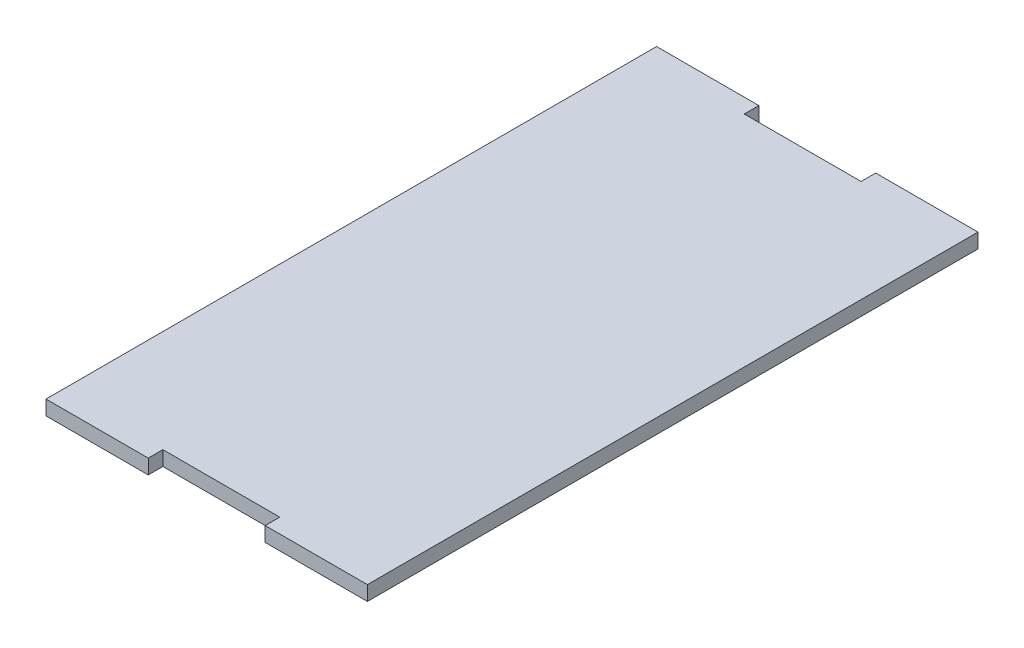
ISO-10303-21;
HEADER;
FILE_DESCRIPTION(('STEP AP214'),'2;1');
FILE_NAME('part.step','',(''),(''),'','','');
FILE_SCHEMA(('AUTOMOTIVE_DESIGN { 1 0 10303 214 1 1 1 1 }'));
ENDSEC;
DATA;
#1=APPLICATION_CONTEXT('core data for automotive mechanical design processes');
#2=APPLICATION_PROTOCOL_DEFINITION('international standard','automotive_design',2000,#1);
#3=PRODUCT_CONTEXT('',#1,'mechanical');
#4=PRODUCT('Part','Part','',(#3));
#5=PRODUCT_RELATED_PRODUCT_CATEGORY('part','',(#4));
#6=PRODUCT_DEFINITION_FORMATION('','',#4);
#7=PRODUCT_DEFINITION_CONTEXT('part definition',#1,'design');
#8=PRODUCT_DEFINITION('design','',#6,#7);
#9=PRODUCT_DEFINITION_SHAPE('','',#8);
#10=(LENGTH_UNIT() NAMED_UNIT(*) SI_UNIT(.MILLI.,.METRE.));
#11=(NAMED_UNIT(*) PLANE_ANGLE_UNIT() SI_UNIT($,.RADIAN.));
#12=(NAMED_UNIT(*) SI_UNIT($,.STERADIAN.) SOLID_ANGLE_UNIT());
#13=UNCERTAINTY_MEASURE_WITH_UNIT(LENGTH_MEASURE(1.E-05),#10,'distance_accuracy_value','');
#14=(GEOMETRIC_REPRESENTATION_CONTEXT(3) GLOBAL_UNCERTAINTY_ASSIGNED_CONTEXT((#13)) GLOBAL_UNIT_ASSIGNED_CONTEXT((#10,
#11,#12)) REPRESENTATION_CONTEXT('',''));
#15=CARTESIAN_POINT('',(0.,0.,0.));
#16=DIRECTION('',(0.,0.,1.));
#17=DIRECTION('',(1.,0.,0.));
#18=AXIS2_PLACEMENT_3D('',#15,#16,#17);
#19=CARTESIAN_POINT('',(0.,6.35,0.));
#20=DIRECTION('',(0.,1.,0.));
#21=DIRECTION('',(0.,0.,1.));
#22=AXIS2_PLACEMENT_3D('',#19,#20,#21);
#23=PLANE('',#22);
#24=DIRECTION('',(1.,0.,0.));
#25=VECTOR('',#24,1.);
#26=CARTESIAN_POINT('',(197.7,6.35,132.7));
#27=LINE('',#26,#25);
#28=CARTESIAN_POINT('',(25.4,6.35,132.7));
#29=VERTEX_POINT('',#28);
#30=CARTESIAN_POINT('',(69.85,6.35,132.7));
#31=VERTEX_POINT('',#30);
#32=EDGE_CURVE('E51',#29,#31,#27,.T.);
#33=ORIENTED_EDGE('',*,*,#32,.T.);
#34=DIRECTION('',(0.,0.,1.));
#35=VECTOR('',#34,1.);
#36=CARTESIAN_POINT('',(69.85,6.35,0.));
#37=LINE('',#36,#35);
#38=CARTESIAN_POINT('',(69.85,6.35,-132.7));
#39=VERTEX_POINT('',#38);
#40=EDGE_CURVE('E59',#39,#31,#37,.T.);
#41=ORIENTED_EDGE('',*,*,#40,.F.);
#42=DIRECTION('',(-1.,0.,0.));
#43=VECTOR('',#42,1.);
#44=CARTESIAN_POINT('',(197.7,6.35,-132.7));
#45=LINE('',#44,#43);
#46=CARTESIAN_POINT('',(25.4,6.35,-132.7));
#47=VERTEX_POINT('',#46);
#48=EDGE_CURVE('E144',#39,#47,#45,.T.);
#49=ORIENTED_EDGE('',*,*,#48,.T.);
#50=DIRECTION('',(0.,0.,-1.));
#51=VECTOR('',#50,1.);
#52=CARTESIAN_POINT('',(25.4000000000001,6.35,0.));
#53=LINE('',#52,#51);
#54=CARTESIAN_POINT('',(25.4,6.35,-126.35));
#55=VERTEX_POINT('',#54);
#56=EDGE_CURVE('E198',#55,#47,#53,.T.);
#57=ORIENTED_EDGE('',*,*,#56,.F.);
#58=DIRECTION('',(1.,0.,0.));
#59=VECTOR('',#58,1.);
#60=CARTESIAN_POINT('',(0.,6.35,-126.35));
#61=LINE('',#60,#59);
#62=CARTESIAN_POINT('',(-25.4,6.35,-126.35));
#63=VERTEX_POINT('',#62);
#64=EDGE_CURVE('E201',#63,#55,#61,.T.);
#65=ORIENTED_EDGE('',*,*,#64,.F.);
#66=DIRECTION('',(0.,0.,-1.));
#67=VECTOR('',#66,1.);
#68=CARTESIAN_POINT('',(-25.3999999999999,6.35,0.));
#69=LINE('',#68,#67);
#70=CARTESIAN_POINT('',(-25.4,6.35,-132.7));
#71=VERTEX_POINT('',#70);
#72=EDGE_CURVE('E205',#63,#71,#69,.T.);
#73=ORIENTED_EDGE('',*,*,#72,.T.);
#74=CARTESIAN_POINT('',(-69.8499999999999,6.35,-132.7));
#75=VERTEX_POINT('',#74);
#76=EDGE_CURVE('E154',#71,#75,#45,.T.);
#77=ORIENTED_EDGE('',*,*,#76,.T.);
#78=DIRECTION('',(0.,0.,1.));
#79=VECTOR('',#78,1.);
#80=CARTESIAN_POINT('',(-69.8499999999999,6.35,0.));
#81=LINE('',#80,#79);
#82=CARTESIAN_POINT('',(-69.8499999999999,6.35,132.7));
#83=VERTEX_POINT('',#82);
#84=EDGE_CURVE('E244',#75,#83,#81,.T.);
#85=ORIENTED_EDGE('',*,*,#84,.T.);
#86=CARTESIAN_POINT('',(-25.4,6.35,132.7));
#87=VERTEX_POINT('',#86);
#88=EDGE_CURVE('E11',#83,#87,#27,.T.);
#89=ORIENTED_EDGE('',*,*,#88,.T.);
#90=DIRECTION('',(0.,0.,1.));
#91=VECTOR('',#90,1.);
#92=CARTESIAN_POINT('',(-25.3999999999999,6.35,0.));
#93=LINE('',#92,#91);
#94=CARTESIAN_POINT('',(-25.4,6.35,126.35));
#95=VERTEX_POINT('',#94);
#96=EDGE_CURVE('E268',#95,#87,#93,.T.);
#97=ORIENTED_EDGE('',*,*,#96,.F.);
#98=DIRECTION('',(-1.,0.,0.));
#99=VECTOR('',#98,1.);
#100=CARTESIAN_POINT('',(0.,6.35,126.35));
#101=LINE('',#100,#99);
#102=CARTESIAN_POINT('',(25.4,6.35,126.35));
#103=VERTEX_POINT('',#102);
#104=EDGE_CURVE('E265',#103,#95,#101,.T.);
#105=ORIENTED_EDGE('',*,*,#104,.F.);
#106=DIRECTION('',(0.,0.,1.));
#107=VECTOR('',#106,1.);
#108=CARTESIAN_POINT('',(25.4000000000001,6.35,0.));
#109=LINE('',#108,#107);
#110=EDGE_CURVE('E197',#103,#29,#109,.T.);
#111=ORIENTED_EDGE('',*,*,#110,.T.);
#112=EDGE_LOOP('',(#33,#41,#49,#57,#65,#73,#77,#85,#89,#97,#105,#111));
#113=FACE_BOUND('',#112,.T.);
#114=ADVANCED_FACE('F41',(#113),#23,.T.);
#115=CARTESIAN_POINT('',(0.,0.,0.));
#116=DIRECTION('',(0.,1.,0.));
#117=DIRECTION('',(0.,0.,1.));
#118=AXIS2_PLACEMENT_3D('',#115,#116,#117);
#119=PLANE('',#118);
#120=DIRECTION('',(0.,0.,1.));
#121=VECTOR('',#120,1.);
#122=CARTESIAN_POINT('',(69.85,0.,0.));
#123=LINE('',#122,#121);
#124=CARTESIAN_POINT('',(69.85,0.,-132.7));
#125=VERTEX_POINT('',#124);
#126=CARTESIAN_POINT('',(69.85,0.,132.7));
#127=VERTEX_POINT('',#126);
#128=EDGE_CURVE('E133',#125,#127,#123,.T.);
#129=ORIENTED_EDGE('',*,*,#128,.T.);
#130=DIRECTION('',(1.,0.,0.));
#131=VECTOR('',#130,1.);
#132=CARTESIAN_POINT('',(197.7,0.,132.7));
#133=LINE('',#132,#131);
#134=CARTESIAN_POINT('',(25.4,0.,132.7));
#135=VERTEX_POINT('',#134);
#136=EDGE_CURVE('E164',#135,#127,#133,.T.);
#137=ORIENTED_EDGE('',*,*,#136,.F.);
#138=DIRECTION('',(0.,0.,1.));
#139=VECTOR('',#138,1.);
#140=CARTESIAN_POINT('',(25.4000000000001,0.,0.));
#141=LINE('',#140,#139);
#142=CARTESIAN_POINT('',(25.4,0.,126.35));
#143=VERTEX_POINT('',#142);
#144=EDGE_CURVE('E189',#143,#135,#141,.T.);
#145=ORIENTED_EDGE('',*,*,#144,.F.);
#146=DIRECTION('',(-1.,0.,0.));
#147=VECTOR('',#146,1.);
#148=CARTESIAN_POINT('',(0.,0.,126.35));
#149=LINE('',#148,#147);
#150=CARTESIAN_POINT('',(-25.4,0.,126.35));
#151=VERTEX_POINT('',#150);
#152=EDGE_CURVE('E257',#143,#151,#149,.T.);
#153=ORIENTED_EDGE('',*,*,#152,.T.);
#154=DIRECTION('',(0.,0.,1.));
#155=VECTOR('',#154,1.);
#156=CARTESIAN_POINT('',(-25.3999999999999,0.,0.));
#157=LINE('',#156,#155);
#158=CARTESIAN_POINT('',(-25.4,0.,132.7));
#159=VERTEX_POINT('',#158);
#160=EDGE_CURVE('E220',#151,#159,#157,.T.);
#161=ORIENTED_EDGE('',*,*,#160,.T.);
#162=CARTESIAN_POINT('',(-69.8499999999999,0.,132.7));
#163=VERTEX_POINT('',#162);
#164=EDGE_CURVE('E45',#163,#159,#133,.T.);
#165=ORIENTED_EDGE('',*,*,#164,.F.);
#166=DIRECTION('',(0.,0.,1.));
#167=VECTOR('',#166,1.);
#168=CARTESIAN_POINT('',(-69.8499999999999,0.,0.));
#169=LINE('',#168,#167);
#170=CARTESIAN_POINT('',(-69.8499999999999,0.,-132.7));
#171=VERTEX_POINT('',#170);
#172=EDGE_CURVE('E67',#171,#163,#169,.T.);
#173=ORIENTED_EDGE('',*,*,#172,.F.);
#174=DIRECTION('',(-1.,0.,0.));
#175=VECTOR('',#174,1.);
#176=CARTESIAN_POINT('',(197.7,0.,-132.7));
#177=LINE('',#176,#175);
#178=CARTESIAN_POINT('',(-25.4,0.,-132.7));
#179=VERTEX_POINT('',#178);
#180=EDGE_CURVE('E165',#179,#171,#177,.T.);
#181=ORIENTED_EDGE('',*,*,#180,.F.);
#182=DIRECTION('',(0.,0.,-1.));
#183=VECTOR('',#182,1.);
#184=CARTESIAN_POINT('',(-25.3999999999999,0.,0.));
#185=LINE('',#184,#183);
#186=CARTESIAN_POINT('',(-25.4,0.,-126.35));
#187=VERTEX_POINT('',#186);
#188=EDGE_CURVE('E202',#187,#179,#185,.T.);
#189=ORIENTED_EDGE('',*,*,#188,.F.);
#190=DIRECTION('',(1.,0.,0.));
#191=VECTOR('',#190,1.);
#192=CARTESIAN_POINT('',(0.,0.,-126.35));
#193=LINE('',#192,#191);
#194=CARTESIAN_POINT('',(25.4,0.,-126.35));
#195=VERTEX_POINT('',#194);
#196=EDGE_CURVE('E212',#187,#195,#193,.T.);
#197=ORIENTED_EDGE('',*,*,#196,.T.);
#198=DIRECTION('',(0.,0.,-1.));
#199=VECTOR('',#198,1.);
#200=CARTESIAN_POINT('',(25.4000000000001,0.,0.));
#201=LINE('',#200,#199);
#202=CARTESIAN_POINT('',(25.4,0.,-132.7));
#203=VERTEX_POINT('',#202);
#204=EDGE_CURVE('E138',#195,#203,#201,.T.);
#205=ORIENTED_EDGE('',*,*,#204,.T.);
#206=EDGE_CURVE('E162',#125,#203,#177,.T.);
#207=ORIENTED_EDGE('',*,*,#206,.F.);
#208=EDGE_LOOP('',(#129,#137,#145,#153,#161,#165,#173,#181,#189,#197,#205,#207));
#209=FACE_BOUND('',#208,.T.);
#210=ADVANCED_FACE('F238',(#209),#119,.F.);
#211=CARTESIAN_POINT('',(197.7,6.35,-132.7));
#212=DIRECTION('',(0.,0.,1.));
#213=DIRECTION('',(1.,0.,0.));
#214=AXIS2_PLACEMENT_3D('',#211,#212,#213);
#215=PLANE('',#214);
#216=DIRECTION('',(0.,-1.,0.));
#217=VECTOR('',#216,1.);
#218=CARTESIAN_POINT('',(69.85,6.35,-132.7));
#219=LINE('',#218,#217);
#220=EDGE_CURVE('E130',#39,#125,#219,.T.);
#221=ORIENTED_EDGE('',*,*,#220,.T.);
#222=ORIENTED_EDGE('',*,*,#206,.T.);
#223=DIRECTION('',(0.,-1.,0.));
#224=VECTOR('',#223,1.);
#225=CARTESIAN_POINT('',(25.4,6.35,-132.7));
#226=LINE('',#225,#224);
#227=EDGE_CURVE('E152',#47,#203,#226,.T.);
#228=ORIENTED_EDGE('',*,*,#227,.F.);
#229=ORIENTED_EDGE('',*,*,#48,.F.);
#230=EDGE_LOOP('',(#221,#222,#228,#229));
#231=FACE_BOUND('',#230,.T.);
#232=ADVANCED_FACE('F43',(#231),#215,.F.);
#233=CARTESIAN_POINT('',(197.7,6.35,132.7));
#234=DIRECTION('',(0.,0.,-1.));
#235=DIRECTION('',(-1.,0.,0.));
#236=AXIS2_PLACEMENT_3D('',#233,#234,#235);
#237=PLANE('',#236);
#238=DIRECTION('',(0.,-1.,0.));
#239=VECTOR('',#238,1.);
#240=CARTESIAN_POINT('',(69.85,6.35,132.7));
#241=LINE('',#240,#239);
#242=EDGE_CURVE('E139',#31,#127,#241,.T.);
#243=ORIENTED_EDGE('',*,*,#242,.F.);
#244=ORIENTED_EDGE('',*,*,#32,.F.);
#245=DIRECTION('',(0.,-1.,0.));
#246=VECTOR('',#245,1.);
#247=CARTESIAN_POINT('',(25.4,6.35,132.7));
#248=LINE('',#247,#246);
#249=EDGE_CURVE('E177',#29,#135,#248,.T.);
#250=ORIENTED_EDGE('',*,*,#249,.T.);
#251=ORIENTED_EDGE('',*,*,#136,.T.);
#252=EDGE_LOOP('',(#243,#244,#250,#251));
#253=FACE_BOUND('',#252,.T.);
#254=ADVANCED_FACE('F282',(#253),#237,.F.);
#255=ORIENTED_EDGE('',*,*,#180,.T.);
#256=DIRECTION('',(0.,-1.,0.));
#257=VECTOR('',#256,1.);
#258=CARTESIAN_POINT('',(-69.8499999999999,6.35,-132.7));
#259=LINE('',#258,#257);
#260=EDGE_CURVE('E242',#75,#171,#259,.T.);
#261=ORIENTED_EDGE('',*,*,#260,.F.);
#262=ORIENTED_EDGE('',*,*,#76,.F.);
#263=DIRECTION('',(0.,-1.,0.));
#264=VECTOR('',#263,1.);
#265=CARTESIAN_POINT('',(-25.4,6.35,-132.7));
#266=LINE('',#265,#264);
#267=EDGE_CURVE('E221',#71,#179,#266,.T.);
#268=ORIENTED_EDGE('',*,*,#267,.T.);
#269=EDGE_LOOP('',(#255,#261,#262,#268));
#270=FACE_BOUND('',#269,.T.);
#271=ADVANCED_FACE('F241',(#270),#215,.F.);
#272=ORIENTED_EDGE('',*,*,#88,.F.);
#273=DIRECTION('',(0.,-1.,0.));
#274=VECTOR('',#273,1.);
#275=CARTESIAN_POINT('',(-69.8499999999999,6.35,132.7));
#276=LINE('',#275,#274);
#277=EDGE_CURVE('E251',#83,#163,#276,.T.);
#278=ORIENTED_EDGE('',*,*,#277,.T.);
#279=ORIENTED_EDGE('',*,*,#164,.T.);
#280=DIRECTION('',(0.,-1.,0.));
#281=VECTOR('',#280,1.);
#282=CARTESIAN_POINT('',(-25.4,6.35,132.7));
#283=LINE('',#282,#281);
#284=EDGE_CURVE('E170',#87,#159,#283,.T.);
#285=ORIENTED_EDGE('',*,*,#284,.F.);
#286=EDGE_LOOP('',(#272,#278,#279,#285));
#287=FACE_BOUND('',#286,.T.);
#288=ADVANCED_FACE('F250',(#287),#237,.F.);
#289=CARTESIAN_POINT('',(-25.3999999999999,6.35,0.));
#290=DIRECTION('',(1.,0.,0.));
#291=DIRECTION('',(0.,0.,-1.));
#292=AXIS2_PLACEMENT_3D('',#289,#290,#291);
#293=PLANE('',#292);
#294=ORIENTED_EDGE('',*,*,#160,.F.);
#295=DIRECTION('',(0.,-1.,0.));
#296=VECTOR('',#295,1.);
#297=CARTESIAN_POINT('',(-25.4,6.35,126.35));
#298=LINE('',#297,#296);
#299=EDGE_CURVE('E194',#95,#151,#298,.T.);
#300=ORIENTED_EDGE('',*,*,#299,.F.);
#301=ORIENTED_EDGE('',*,*,#96,.T.);
#302=ORIENTED_EDGE('',*,*,#284,.T.);
#303=EDGE_LOOP('',(#294,#300,#301,#302));
#304=FACE_BOUND('',#303,.T.);
#305=ADVANCED_FACE('F289',(#304),#293,.T.);
#306=CARTESIAN_POINT('',(25.4000000000001,6.35,0.));
#307=DIRECTION('',(1.,0.,0.));
#308=DIRECTION('',(0.,0.,-1.));
#309=AXIS2_PLACEMENT_3D('',#306,#307,#308);
#310=PLANE('',#309);
#311=ORIENTED_EDGE('',*,*,#144,.T.);
#312=ORIENTED_EDGE('',*,*,#249,.F.);
#313=ORIENTED_EDGE('',*,*,#110,.F.);
#314=DIRECTION('',(0.,-1.,0.));
#315=VECTOR('',#314,1.);
#316=CARTESIAN_POINT('',(25.4,6.35,126.35));
#317=LINE('',#316,#315);
#318=EDGE_CURVE('E186',#103,#143,#317,.T.);
#319=ORIENTED_EDGE('',*,*,#318,.T.);
#320=EDGE_LOOP('',(#311,#312,#313,#319));
#321=FACE_BOUND('',#320,.T.);
#322=ADVANCED_FACE('F285',(#321),#310,.F.);
#323=CARTESIAN_POINT('',(0.,6.35,126.35));
#324=DIRECTION('',(0.,0.,1.));
#325=DIRECTION('',(1.,0.,0.));
#326=AXIS2_PLACEMENT_3D('',#323,#324,#325);
#327=PLANE('',#326);
#328=ORIENTED_EDGE('',*,*,#152,.F.);
#329=ORIENTED_EDGE('',*,*,#318,.F.);
#330=ORIENTED_EDGE('',*,*,#104,.T.);
#331=ORIENTED_EDGE('',*,*,#299,.T.);
#332=EDGE_LOOP('',(#328,#329,#330,#331));
#333=FACE_BOUND('',#332,.T.);
#334=ADVANCED_FACE('F288',(#333),#327,.T.);
#335=CARTESIAN_POINT('',(25.4000000000001,6.35,0.));
#336=DIRECTION('',(-1.,0.,0.));
#337=DIRECTION('',(0.,0.,1.));
#338=AXIS2_PLACEMENT_3D('',#335,#336,#337);
#339=PLANE('',#338);
#340=ORIENTED_EDGE('',*,*,#204,.F.);
#341=DIRECTION('',(0.,-1.,0.));
#342=VECTOR('',#341,1.);
#343=CARTESIAN_POINT('',(25.4,6.35,-126.35));
#344=LINE('',#343,#342);
#345=EDGE_CURVE('E160',#55,#195,#344,.T.);
#346=ORIENTED_EDGE('',*,*,#345,.F.);
#347=ORIENTED_EDGE('',*,*,#56,.T.);
#348=ORIENTED_EDGE('',*,*,#227,.T.);
#349=EDGE_LOOP('',(#340,#346,#347,#348));
#350=FACE_BOUND('',#349,.T.);
#351=ADVANCED_FACE('F236',(#350),#339,.T.);
#352=CARTESIAN_POINT('',(-25.3999999999999,6.35,0.));
#353=DIRECTION('',(-1.,0.,0.));
#354=DIRECTION('',(0.,0.,1.));
#355=AXIS2_PLACEMENT_3D('',#352,#353,#354);
#356=PLANE('',#355);
#357=ORIENTED_EDGE('',*,*,#188,.T.);
#358=ORIENTED_EDGE('',*,*,#267,.F.);
#359=ORIENTED_EDGE('',*,*,#72,.F.);
#360=DIRECTION('',(0.,-1.,0.));
#361=VECTOR('',#360,1.);
#362=CARTESIAN_POINT('',(-25.4,6.35,-126.35));
#363=LINE('',#362,#361);
#364=EDGE_CURVE('E223',#63,#187,#363,.T.);
#365=ORIENTED_EDGE('',*,*,#364,.T.);
#366=EDGE_LOOP('',(#357,#358,#359,#365));
#367=FACE_BOUND('',#366,.T.);
#368=ADVANCED_FACE('F239',(#367),#356,.F.);
#369=CARTESIAN_POINT('',(0.,6.35,-126.35));
#370=DIRECTION('',(0.,0.,-1.));
#371=DIRECTION('',(-1.,0.,0.));
#372=AXIS2_PLACEMENT_3D('',#369,#370,#371);
#373=PLANE('',#372);
#374=ORIENTED_EDGE('',*,*,#196,.F.);
#375=ORIENTED_EDGE('',*,*,#364,.F.);
#376=ORIENTED_EDGE('',*,*,#64,.T.);
#377=ORIENTED_EDGE('',*,*,#345,.T.);
#378=EDGE_LOOP('',(#374,#375,#376,#377));
#379=FACE_BOUND('',#378,.T.);
#380=ADVANCED_FACE('F232',(#379),#373,.T.);
#381=CARTESIAN_POINT('',(-69.8499999999999,6.35,0.));
#382=DIRECTION('',(1.,0.,0.));
#383=DIRECTION('',(0.,0.,-1.));
#384=AXIS2_PLACEMENT_3D('',#381,#382,#383);
#385=PLANE('',#384);
#386=ORIENTED_EDGE('',*,*,#172,.T.);
#387=ORIENTED_EDGE('',*,*,#277,.F.);
#388=ORIENTED_EDGE('',*,*,#84,.F.);
#389=ORIENTED_EDGE('',*,*,#260,.T.);
#390=EDGE_LOOP('',(#386,#387,#388,#389));
#391=FACE_BOUND('',#390,.T.);
#392=ADVANCED_FACE('F336',(#391),#385,.F.);
#393=CARTESIAN_POINT('',(69.85,6.35,0.));
#394=DIRECTION('',(1.,0.,0.));
#395=DIRECTION('',(0.,0.,-1.));
#396=AXIS2_PLACEMENT_3D('',#393,#394,#395);
#397=PLANE('',#396);
#398=ORIENTED_EDGE('',*,*,#128,.F.);
#399=ORIENTED_EDGE('',*,*,#220,.F.);
#400=ORIENTED_EDGE('',*,*,#40,.T.);
#401=ORIENTED_EDGE('',*,*,#242,.T.);
#402=EDGE_LOOP('',(#398,#399,#400,#401));
#403=FACE_BOUND('',#402,.T.);
#404=ADVANCED_FACE('F131',(#403),#397,.T.);
#405=CLOSED_SHELL('',(#114,#210,#232,#254,#271,#288,#305,#322,#334,#351,#368,#380,#392,#404));
#406=MANIFOLD_SOLID_BREP('B2',#405);
#407=ADVANCED_BREP_SHAPE_REPRESENTATION('',(#18,#406),#14);
#408=SHAPE_DEFINITION_REPRESENTATION(#9,#407);
ENDSEC;
END-ISO-10303-21;
